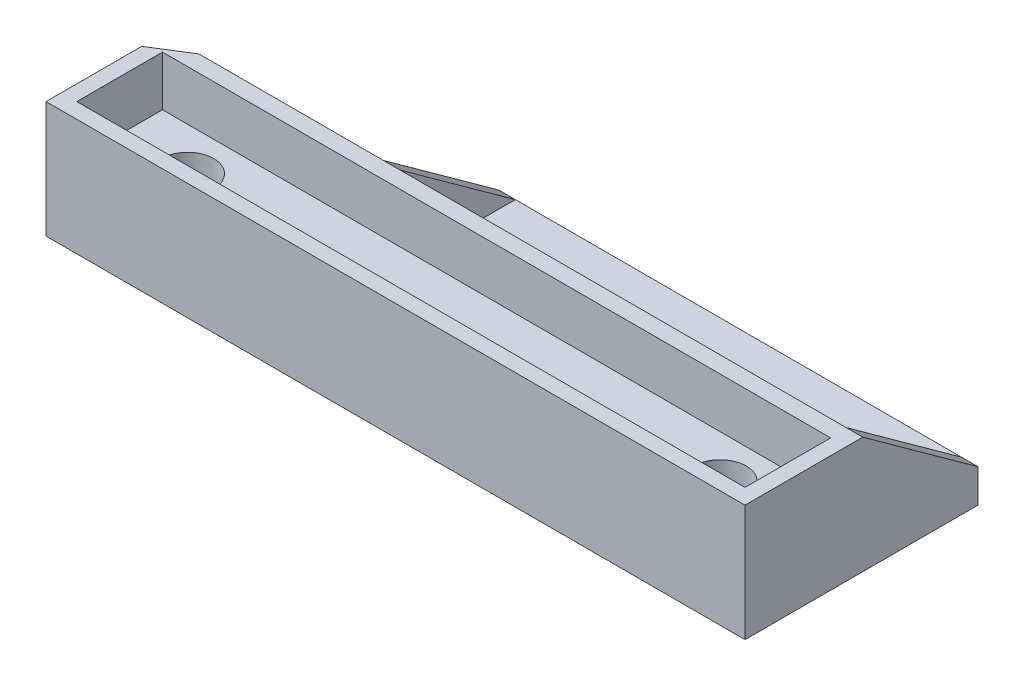
ISO-10303-21;
HEADER;
FILE_DESCRIPTION(('STEP AP214'),'2;1');
FILE_NAME('part.step','',(''),(''),'','','');
FILE_SCHEMA(('AUTOMOTIVE_DESIGN { 1 0 10303 214 1 1 1 1 }'));
ENDSEC;
DATA;
#1=APPLICATION_CONTEXT('core data for automotive mechanical design processes');
#2=APPLICATION_PROTOCOL_DEFINITION('international standard','automotive_design',2000,#1);
#3=PRODUCT_CONTEXT('',#1,'mechanical');
#4=PRODUCT('Part','Part','',(#3));
#5=PRODUCT_RELATED_PRODUCT_CATEGORY('part','',(#4));
#6=PRODUCT_DEFINITION_FORMATION('','',#4);
#7=PRODUCT_DEFINITION_CONTEXT('part definition',#1,'design');
#8=PRODUCT_DEFINITION('design','',#6,#7);
#9=PRODUCT_DEFINITION_SHAPE('','',#8);
#10=(LENGTH_UNIT() NAMED_UNIT(*) SI_UNIT(.MILLI.,.METRE.));
#11=(NAMED_UNIT(*) PLANE_ANGLE_UNIT() SI_UNIT($,.RADIAN.));
#12=(NAMED_UNIT(*) SI_UNIT($,.STERADIAN.) SOLID_ANGLE_UNIT());
#13=UNCERTAINTY_MEASURE_WITH_UNIT(LENGTH_MEASURE(1.E-05),#10,'distance_accuracy_value','');
#14=(GEOMETRIC_REPRESENTATION_CONTEXT(3) GLOBAL_UNCERTAINTY_ASSIGNED_CONTEXT((#13)) GLOBAL_UNIT_ASSIGNED_CONTEXT((#10,
#11,#12)) REPRESENTATION_CONTEXT('',''));
#15=CARTESIAN_POINT('',(0.,0.,0.));
#16=DIRECTION('',(0.,0.,1.));
#17=DIRECTION('',(1.,0.,0.));
#18=AXIS2_PLACEMENT_3D('',#15,#16,#17);
#19=CARTESIAN_POINT('',(5.,7.,-3.49999999993634));
#20=DIRECTION('',(0.,-1.,0.));
#21=DIRECTION('',(0.,0.,-1.));
#22=AXIS2_PLACEMENT_3D('',#19,#20,#21);
#23=CYLINDRICAL_SURFACE('',#22,1.575);
#24=CARTESIAN_POINT('',(5.,0.,-3.49999999993634));
#25=DIRECTION('',(0.,-1.,0.));
#26=DIRECTION('',(0.,0.,1.));
#27=AXIS2_PLACEMENT_3D('',#24,#25,#26);
#28=CIRCLE('',#27,1.575);
#29=CARTESIAN_POINT('',(5.,0.,-1.92499999993634));
#30=VERTEX_POINT('',#29);
#31=EDGE_CURVE('E227',#30,#30,#28,.T.);
#32=ORIENTED_EDGE('',*,*,#31,.T.);
#33=EDGE_LOOP('',(#32));
#34=FACE_BOUND('',#33,.T.);
#35=CARTESIAN_POINT('',(5.,4.,-3.49999999993634));
#36=DIRECTION('',(0.,1.,0.));
#37=DIRECTION('',(0.,0.,1.));
#38=AXIS2_PLACEMENT_3D('',#35,#36,#37);
#39=CIRCLE('',#38,1.575);
#40=CARTESIAN_POINT('',(5.,4.,-1.92499999993634));
#41=VERTEX_POINT('',#40);
#42=EDGE_CURVE('E224',#41,#41,#39,.F.);
#43=ORIENTED_EDGE('',*,*,#42,.F.);
#44=EDGE_LOOP('',(#43));
#45=FACE_BOUND('',#44,.T.);
#46=ADVANCED_FACE('F41',(#34,#45),#23,.F.);
#47=CARTESIAN_POINT('',(37.,7.,-3.49999999993633));
#48=DIRECTION('',(0.,-1.,0.));
#49=DIRECTION('',(0.,0.,-1.));
#50=AXIS2_PLACEMENT_3D('',#47,#48,#49);
#51=CYLINDRICAL_SURFACE('',#50,1.575);
#52=CARTESIAN_POINT('',(37.,0.,-3.49999999993633));
#53=DIRECTION('',(0.,-1.,0.));
#54=DIRECTION('',(0.,0.,-1.));
#55=AXIS2_PLACEMENT_3D('',#52,#53,#54);
#56=CIRCLE('',#55,1.575);
#57=CARTESIAN_POINT('',(37.,0.,-5.07499999993633));
#58=VERTEX_POINT('',#57);
#59=EDGE_CURVE('E228',#58,#58,#56,.T.);
#60=ORIENTED_EDGE('',*,*,#59,.T.);
#61=EDGE_LOOP('',(#60));
#62=FACE_BOUND('',#61,.T.);
#63=CARTESIAN_POINT('',(37.,4.,-3.49999999993633));
#64=DIRECTION('',(0.,1.,0.));
#65=DIRECTION('',(0.,0.,1.));
#66=AXIS2_PLACEMENT_3D('',#63,#64,#65);
#67=CIRCLE('',#66,1.575);
#68=CARTESIAN_POINT('',(37.,4.,-1.92499999993633));
#69=VERTEX_POINT('',#68);
#70=EDGE_CURVE('E217',#69,#69,#67,.F.);
#71=ORIENTED_EDGE('',*,*,#70,.F.);
#72=EDGE_LOOP('',(#71));
#73=FACE_BOUND('',#72,.T.);
#74=ADVANCED_FACE('F369',(#62,#73),#51,.F.);
#75=CARTESIAN_POINT('',(42.,7.,-6.99999999987266));
#76=DIRECTION('',(-1.,0.,0.));
#77=DIRECTION('',(0.,0.,1.));
#78=AXIS2_PLACEMENT_3D('',#75,#76,#77);
#79=PLANE('',#78);
#80=DIRECTION('',(0.,-1.,0.));
#81=VECTOR('',#80,1.);
#82=CARTESIAN_POINT('',(42.,7.,-13.9999999998727));
#83=LINE('',#82,#81);
#84=CARTESIAN_POINT('',(42.,2.,-13.9999999998727));
#85=VERTEX_POINT('',#84);
#86=CARTESIAN_POINT('',(42.,0.,-13.9999999998727));
#87=VERTEX_POINT('',#86);
#88=EDGE_CURVE('E175',#85,#87,#83,.T.);
#89=ORIENTED_EDGE('',*,*,#88,.F.);
#90=DIRECTION('',(0.,0.585383683581828,0.810756401760831));
#91=VECTOR('',#90,1.);
#92=CARTESIAN_POINT('',(42.,7.,-7.07499999987266));
#93=LINE('',#92,#91);
#94=CARTESIAN_POINT('',(42.,7.,-7.07499999987266));
#95=VERTEX_POINT('',#94);
#96=EDGE_CURVE('E156',#85,#95,#93,.T.);
#97=ORIENTED_EDGE('',*,*,#96,.T.);
#98=DIRECTION('',(0.,0.,-1.));
#99=VECTOR('',#98,1.);
#100=CARTESIAN_POINT('',(42.,7.,-6.99999999987266));
#101=LINE('',#100,#99);
#102=CARTESIAN_POINT('',(42.,7.,0.));
#103=VERTEX_POINT('',#102);
#104=EDGE_CURVE('E233',#103,#95,#101,.T.);
#105=ORIENTED_EDGE('',*,*,#104,.F.);
#106=DIRECTION('',(0.,-1.,0.));
#107=VECTOR('',#106,1.);
#108=CARTESIAN_POINT('',(42.,7.,0.));
#109=LINE('',#108,#107);
#110=CARTESIAN_POINT('',(42.,0.,0.));
#111=VERTEX_POINT('',#110);
#112=EDGE_CURVE('E242',#103,#111,#109,.T.);
#113=ORIENTED_EDGE('',*,*,#112,.T.);
#114=DIRECTION('',(0.,0.,-1.));
#115=VECTOR('',#114,1.);
#116=CARTESIAN_POINT('',(42.,0.,-6.99999999987266));
#117=LINE('',#116,#115);
#118=EDGE_CURVE('E185',#111,#87,#117,.T.);
#119=ORIENTED_EDGE('',*,*,#118,.T.);
#120=EDGE_LOOP('',(#89,#97,#105,#113,#119));
#121=FACE_BOUND('',#120,.T.);
#122=ADVANCED_FACE('F182',(#121),#79,.F.);
#123=CARTESIAN_POINT('',(0.,7.,-5.75));
#124=DIRECTION('',(0.529919264233527,0.,0.848048096156224));
#125=DIRECTION('',(0.848048096156224,0.,-0.529919264233527));
#126=AXIS2_PLACEMENT_3D('',#123,#124,#125);
#127=PLANE('',#126);
#128=DIRECTION('',(-0.848048096156224,0.,0.529919264233527));
#129=VECTOR('',#128,1.);
#130=CARTESIAN_POINT('',(0.,7.,-5.75));
#131=LINE('',#130,#129);
#132=CARTESIAN_POINT('',(2.12044325077533,7.,-7.07499999987266));
#133=VERTEX_POINT('',#132);
#134=CARTESIAN_POINT('',(0.,7.,-5.75));
#135=VERTEX_POINT('',#134);
#136=EDGE_CURVE('E235',#133,#135,#131,.T.);
#137=ORIENTED_EDGE('',*,*,#136,.F.);
#138=DIRECTION('',(0.,1.,0.));
#139=VECTOR('',#138,1.);
#140=CARTESIAN_POINT('',(2.12044325077533,2.,-7.07499999987266));
#141=LINE('',#140,#139);
#142=CARTESIAN_POINT('',(2.12044325077533,3.,-7.07499999987266));
#143=VERTEX_POINT('',#142);
#144=EDGE_CURVE('E284',#143,#133,#141,.T.);
#145=ORIENTED_EDGE('',*,*,#144,.F.);
#146=DIRECTION('',(-0.749337346632538,0.468237942152119,0.468237942152125));
#147=VECTOR('',#146,1.);
#148=CARTESIAN_POINT('',(-0.938572373960924,4.91148511091009,-5.16351488896254));
#149=LINE('',#148,#147);
#150=CARTESIAN_POINT('',(3.72077777981619,2.,-8.07499999987267));
#151=VERTEX_POINT('',#150);
#152=EDGE_CURVE('E11',#143,#151,#149,.F.);
#153=ORIENTED_EDGE('',*,*,#152,.T.);
#154=DIRECTION('',(-0.848048096156395,0.,0.529919264233255));
#155=VECTOR('',#154,1.);
#156=CARTESIAN_POINT('',(13.2027598643832,2.,-13.9999999998727));
#157=LINE('',#156,#155);
#158=CARTESIAN_POINT('',(13.2027598643832,2.,-13.9999999998727));
#159=VERTEX_POINT('',#158);
#160=EDGE_CURVE('E277',#159,#151,#157,.T.);
#161=ORIENTED_EDGE('',*,*,#160,.F.);
#162=DIRECTION('',(0.,-1.,0.));
#163=VECTOR('',#162,1.);
#164=CARTESIAN_POINT('',(13.2027598643832,7.,-13.9999999998727));
#165=LINE('',#164,#163);
#166=CARTESIAN_POINT('',(13.2027598643832,0.,-13.9999999998727));
#167=VERTEX_POINT('',#166);
#168=EDGE_CURVE('E188',#159,#167,#165,.T.);
#169=ORIENTED_EDGE('',*,*,#168,.T.);
#170=DIRECTION('',(-0.848048096156224,0.,0.529919264233527));
#171=VECTOR('',#170,1.);
#172=CARTESIAN_POINT('',(0.,0.,-5.75));
#173=LINE('',#172,#171);
#174=CARTESIAN_POINT('',(0.,0.,-5.75));
#175=VERTEX_POINT('',#174);
#176=EDGE_CURVE('E244',#167,#175,#173,.T.);
#177=ORIENTED_EDGE('',*,*,#176,.T.);
#178=DIRECTION('',(0.,-1.,0.));
#179=VECTOR('',#178,1.);
#180=CARTESIAN_POINT('',(0.,7.,-5.75));
#181=LINE('',#180,#179);
#182=EDGE_CURVE('E253',#135,#175,#181,.T.);
#183=ORIENTED_EDGE('',*,*,#182,.F.);
#184=EDGE_LOOP('',(#137,#145,#153,#161,#169,#177,#183));
#185=FACE_BOUND('',#184,.T.);
#186=ADVANCED_FACE('F339',(#185),#127,.F.);
#187=CARTESIAN_POINT('',(0.,7.,-5.75));
#188=DIRECTION('',(1.,0.,0.));
#189=DIRECTION('',(0.,0.,-1.));
#190=AXIS2_PLACEMENT_3D('',#187,#188,#189);
#191=PLANE('',#190);
#192=DIRECTION('',(0.,0.,1.));
#193=VECTOR('',#192,1.);
#194=CARTESIAN_POINT('',(0.,0.,-5.75));
#195=LINE('',#194,#193);
#196=CARTESIAN_POINT('',(0.,0.,0.));
#197=VERTEX_POINT('',#196);
#198=EDGE_CURVE('E246',#175,#197,#195,.T.);
#199=ORIENTED_EDGE('',*,*,#198,.T.);
#200=DIRECTION('',(0.,-1.,0.));
#201=VECTOR('',#200,1.);
#202=CARTESIAN_POINT('',(0.,7.,0.));
#203=LINE('',#202,#201);
#204=CARTESIAN_POINT('',(0.,7.,0.));
#205=VERTEX_POINT('',#204);
#206=EDGE_CURVE('E250',#205,#197,#203,.T.);
#207=ORIENTED_EDGE('',*,*,#206,.F.);
#208=DIRECTION('',(0.,0.,1.));
#209=VECTOR('',#208,1.);
#210=CARTESIAN_POINT('',(0.,7.,-5.75));
#211=LINE('',#210,#209);
#212=EDGE_CURVE('E238',#135,#205,#211,.T.);
#213=ORIENTED_EDGE('',*,*,#212,.F.);
#214=ORIENTED_EDGE('',*,*,#182,.T.);
#215=EDGE_LOOP('',(#199,#207,#213,#214));
#216=FACE_BOUND('',#215,.T.);
#217=ADVANCED_FACE('F345',(#216),#191,.F.);
#218=CARTESIAN_POINT('',(0.,7.,0.));
#219=DIRECTION('',(0.,0.,-1.));
#220=DIRECTION('',(-1.,0.,0.));
#221=AXIS2_PLACEMENT_3D('',#218,#219,#220);
#222=PLANE('',#221);
#223=DIRECTION('',(1.,0.,0.));
#224=VECTOR('',#223,1.);
#225=CARTESIAN_POINT('',(0.,0.,0.));
#226=LINE('',#225,#224);
#227=EDGE_CURVE('E236',#197,#111,#226,.T.);
#228=ORIENTED_EDGE('',*,*,#227,.T.);
#229=ORIENTED_EDGE('',*,*,#112,.F.);
#230=DIRECTION('',(1.,0.,0.));
#231=VECTOR('',#230,1.);
#232=CARTESIAN_POINT('',(0.,7.,0.));
#233=LINE('',#232,#231);
#234=EDGE_CURVE('E240',#205,#103,#233,.T.);
#235=ORIENTED_EDGE('',*,*,#234,.F.);
#236=ORIENTED_EDGE('',*,*,#206,.T.);
#237=EDGE_LOOP('',(#228,#229,#235,#236));
#238=FACE_BOUND('',#237,.T.);
#239=ADVANCED_FACE('F349',(#238),#222,.F.);
#240=CARTESIAN_POINT('',(0.,7.,0.));
#241=DIRECTION('',(0.,1.,0.));
#242=DIRECTION('',(0.,0.,1.));
#243=AXIS2_PLACEMENT_3D('',#240,#241,#242);
#244=PLANE('',#243);
#245=DIRECTION('',(-1.,0.,0.));
#246=VECTOR('',#245,1.);
#247=CARTESIAN_POINT('',(42.,7.,-7.07499999987266));
#248=LINE('',#247,#246);
#249=CARTESIAN_POINT('',(14.2027598643832,7.,-7.07499999987266));
#250=VERTEX_POINT('',#249);
#251=CARTESIAN_POINT('',(13.2027598643832,7.,-7.07499999987266));
#252=VERTEX_POINT('',#251);
#253=EDGE_CURVE('E180',#250,#252,#248,.T.);
#254=ORIENTED_EDGE('',*,*,#253,.T.);
#255=DIRECTION('',(1.,0.,0.));
#256=VECTOR('',#255,1.);
#257=CARTESIAN_POINT('',(2.12044325077533,7.,-7.07499999987266));
#258=LINE('',#257,#256);
#259=EDGE_CURVE('E286',#133,#252,#258,.T.);
#260=ORIENTED_EDGE('',*,*,#259,.F.);
#261=ORIENTED_EDGE('',*,*,#136,.T.);
#262=ORIENTED_EDGE('',*,*,#212,.T.);
#263=ORIENTED_EDGE('',*,*,#234,.T.);
#264=ORIENTED_EDGE('',*,*,#104,.T.);
#265=CARTESIAN_POINT('',(41.,7.,-7.07499999987266));
#266=VERTEX_POINT('',#265);
#267=EDGE_CURVE('E163',#95,#266,#248,.T.);
#268=ORIENTED_EDGE('',*,*,#267,.T.);
#269=DIRECTION('',(1.,0.,0.));
#270=VECTOR('',#269,1.);
#271=CARTESIAN_POINT('',(41.,7.,-7.07499999987266));
#272=LINE('',#271,#270);
#273=EDGE_CURVE('E302',#250,#266,#272,.T.);
#274=ORIENTED_EDGE('',*,*,#273,.F.);
#275=EDGE_LOOP('',(#254,#260,#261,#262,#263,#264,#268,#274));
#276=FACE_BOUND('',#275,.T.);
#277=DIRECTION('',(0.,0.,1.));
#278=VECTOR('',#277,1.);
#279=CARTESIAN_POINT('',(0.925000000000002,7.,-6.07499999987266));
#280=LINE('',#279,#278);
#281=CARTESIAN_POINT('',(0.925000000000002,7.,-6.07499999987266));
#282=VERTEX_POINT('',#281);
#283=CARTESIAN_POINT('',(0.925000000000003,7.,-0.924999999872662));
#284=VERTEX_POINT('',#283);
#285=EDGE_CURVE('E187',#282,#284,#280,.T.);
#286=ORIENTED_EDGE('',*,*,#285,.F.);
#287=DIRECTION('',(1.,0.,0.));
#288=VECTOR('',#287,1.);
#289=CARTESIAN_POINT('',(0.925000000000002,7.,-6.07499999987266));
#290=LINE('',#289,#288);
#291=CARTESIAN_POINT('',(41.075,7.,-6.07499999987266));
#292=VERTEX_POINT('',#291);
#293=EDGE_CURVE('E200',#282,#292,#290,.T.);
#294=ORIENTED_EDGE('',*,*,#293,.T.);
#295=DIRECTION('',(0.,0.,1.));
#296=VECTOR('',#295,1.);
#297=CARTESIAN_POINT('',(41.075,7.,-6.07499999987266));
#298=LINE('',#297,#296);
#299=CARTESIAN_POINT('',(41.075,7.,-0.924999999872662));
#300=VERTEX_POINT('',#299);
#301=EDGE_CURVE('E210',#292,#300,#298,.T.);
#302=ORIENTED_EDGE('',*,*,#301,.T.);
#303=DIRECTION('',(1.,0.,0.));
#304=VECTOR('',#303,1.);
#305=CARTESIAN_POINT('',(0.925000000000003,7.,-0.924999999872662));
#306=LINE('',#305,#304);
#307=EDGE_CURVE('E190',#284,#300,#306,.T.);
#308=ORIENTED_EDGE('',*,*,#307,.F.);
#309=EDGE_LOOP('',(#286,#294,#302,#308));
#310=FACE_BOUND('',#309,.T.);
#311=ADVANCED_FACE('F335',(#276,#310),#244,.T.);
#312=CARTESIAN_POINT('',(0.,0.,0.));
#313=DIRECTION('',(0.,1.,0.));
#314=DIRECTION('',(0.,0.,1.));
#315=AXIS2_PLACEMENT_3D('',#312,#313,#314);
#316=PLANE('',#315);
#317=ORIENTED_EDGE('',*,*,#59,.F.);
#318=EDGE_LOOP('',(#317));
#319=FACE_BOUND('',#318,.T.);
#320=ORIENTED_EDGE('',*,*,#31,.F.);
#321=EDGE_LOOP('',(#320));
#322=FACE_BOUND('',#321,.T.);
#323=ORIENTED_EDGE('',*,*,#118,.F.);
#324=ORIENTED_EDGE('',*,*,#227,.F.);
#325=ORIENTED_EDGE('',*,*,#198,.F.);
#326=ORIENTED_EDGE('',*,*,#176,.F.);
#327=DIRECTION('',(-1.,0.,0.));
#328=VECTOR('',#327,1.);
#329=CARTESIAN_POINT('',(42.,0.,-13.9999999998727));
#330=LINE('',#329,#328);
#331=EDGE_CURVE('E192',#87,#167,#330,.T.);
#332=ORIENTED_EDGE('',*,*,#331,.F.);
#333=EDGE_LOOP('',(#323,#324,#325,#326,#332));
#334=FACE_BOUND('',#333,.T.);
#335=ADVANCED_FACE('F352',(#319,#322,#334),#316,.F.);
#336=CARTESIAN_POINT('',(0.,4.,0.));
#337=DIRECTION('',(0.,1.,0.));
#338=DIRECTION('',(0.,0.,1.));
#339=AXIS2_PLACEMENT_3D('',#336,#337,#338);
#340=PLANE('',#339);
#341=DIRECTION('',(0.,0.,1.));
#342=VECTOR('',#341,1.);
#343=CARTESIAN_POINT('',(0.925000000000002,4.,-6.07499999987266));
#344=LINE('',#343,#342);
#345=CARTESIAN_POINT('',(0.925000000000002,4.,-6.07499999987266));
#346=VERTEX_POINT('',#345);
#347=CARTESIAN_POINT('',(0.925000000000003,4.,-0.924999999872662));
#348=VERTEX_POINT('',#347);
#349=EDGE_CURVE('E196',#346,#348,#344,.T.);
#350=ORIENTED_EDGE('',*,*,#349,.T.);
#351=DIRECTION('',(1.,0.,0.));
#352=VECTOR('',#351,1.);
#353=CARTESIAN_POINT('',(0.925000000000003,4.,-0.924999999872662));
#354=LINE('',#353,#352);
#355=CARTESIAN_POINT('',(41.075,4.,-0.924999999872662));
#356=VERTEX_POINT('',#355);
#357=EDGE_CURVE('E199',#348,#356,#354,.T.);
#358=ORIENTED_EDGE('',*,*,#357,.T.);
#359=DIRECTION('',(0.,0.,1.));
#360=VECTOR('',#359,1.);
#361=CARTESIAN_POINT('',(41.075,4.,-6.07499999987266));
#362=LINE('',#361,#360);
#363=CARTESIAN_POINT('',(41.075,4.,-6.07499999987266));
#364=VERTEX_POINT('',#363);
#365=EDGE_CURVE('E203',#364,#356,#362,.T.);
#366=ORIENTED_EDGE('',*,*,#365,.F.);
#367=DIRECTION('',(1.,0.,0.));
#368=VECTOR('',#367,1.);
#369=CARTESIAN_POINT('',(0.925000000000002,4.,-6.07499999987266));
#370=LINE('',#369,#368);
#371=EDGE_CURVE('E205',#346,#364,#370,.T.);
#372=ORIENTED_EDGE('',*,*,#371,.F.);
#373=EDGE_LOOP('',(#350,#358,#366,#372));
#374=FACE_BOUND('',#373,.T.);
#375=ORIENTED_EDGE('',*,*,#70,.T.);
#376=EDGE_LOOP('',(#375));
#377=FACE_BOUND('',#376,.T.);
#378=ORIENTED_EDGE('',*,*,#42,.T.);
#379=EDGE_LOOP('',(#378));
#380=FACE_BOUND('',#379,.T.);
#381=ADVANCED_FACE('F354',(#374,#377,#380),#340,.T.);
#382=CARTESIAN_POINT('',(0.925000000000002,4.,-6.07499999987266));
#383=DIRECTION('',(-1.,0.,0.));
#384=DIRECTION('',(0.,0.,1.));
#385=AXIS2_PLACEMENT_3D('',#382,#383,#384);
#386=PLANE('',#385);
#387=ORIENTED_EDGE('',*,*,#285,.T.);
#388=DIRECTION('',(0.,1.,0.));
#389=VECTOR('',#388,1.);
#390=CARTESIAN_POINT('',(0.925000000000003,4.,-0.924999999872662));
#391=LINE('',#390,#389);
#392=EDGE_CURVE('E206',#348,#284,#391,.T.);
#393=ORIENTED_EDGE('',*,*,#392,.F.);
#394=ORIENTED_EDGE('',*,*,#349,.F.);
#395=DIRECTION('',(0.,1.,0.));
#396=VECTOR('',#395,1.);
#397=CARTESIAN_POINT('',(0.925000000000002,4.,-6.07499999987266));
#398=LINE('',#397,#396);
#399=EDGE_CURVE('E215',#346,#282,#398,.T.);
#400=ORIENTED_EDGE('',*,*,#399,.T.);
#401=EDGE_LOOP('',(#387,#393,#394,#400));
#402=FACE_BOUND('',#401,.T.);
#403=ADVANCED_FACE('F361',(#402),#386,.F.);
#404=CARTESIAN_POINT('',(0.925000000000002,4.,-6.07499999987266));
#405=DIRECTION('',(0.,0.,1.));
#406=DIRECTION('',(1.,0.,0.));
#407=AXIS2_PLACEMENT_3D('',#404,#405,#406);
#408=PLANE('',#407);
#409=ORIENTED_EDGE('',*,*,#293,.F.);
#410=ORIENTED_EDGE('',*,*,#399,.F.);
#411=ORIENTED_EDGE('',*,*,#371,.T.);
#412=DIRECTION('',(0.,1.,0.));
#413=VECTOR('',#412,1.);
#414=CARTESIAN_POINT('',(41.075,4.,-6.07499999987266));
#415=LINE('',#414,#413);
#416=EDGE_CURVE('E218',#364,#292,#415,.T.);
#417=ORIENTED_EDGE('',*,*,#416,.T.);
#418=EDGE_LOOP('',(#409,#410,#411,#417));
#419=FACE_BOUND('',#418,.T.);
#420=ADVANCED_FACE('F381',(#419),#408,.T.);
#421=CARTESIAN_POINT('',(41.075,4.,-6.07499999987266));
#422=DIRECTION('',(-1.,0.,0.));
#423=DIRECTION('',(0.,0.,1.));
#424=AXIS2_PLACEMENT_3D('',#421,#422,#423);
#425=PLANE('',#424);
#426=ORIENTED_EDGE('',*,*,#301,.F.);
#427=ORIENTED_EDGE('',*,*,#416,.F.);
#428=ORIENTED_EDGE('',*,*,#365,.T.);
#429=DIRECTION('',(0.,1.,0.));
#430=VECTOR('',#429,1.);
#431=CARTESIAN_POINT('',(41.075,4.,-0.924999999872662));
#432=LINE('',#431,#430);
#433=EDGE_CURVE('E220',#356,#300,#432,.T.);
#434=ORIENTED_EDGE('',*,*,#433,.T.);
#435=EDGE_LOOP('',(#426,#427,#428,#434));
#436=FACE_BOUND('',#435,.T.);
#437=ADVANCED_FACE('F386',(#436),#425,.T.);
#438=CARTESIAN_POINT('',(0.925000000000003,4.,-0.924999999872662));
#439=DIRECTION('',(0.,0.,1.));
#440=DIRECTION('',(1.,0.,0.));
#441=AXIS2_PLACEMENT_3D('',#438,#439,#440);
#442=PLANE('',#441);
#443=ORIENTED_EDGE('',*,*,#307,.T.);
#444=ORIENTED_EDGE('',*,*,#433,.F.);
#445=ORIENTED_EDGE('',*,*,#357,.F.);
#446=ORIENTED_EDGE('',*,*,#392,.T.);
#447=EDGE_LOOP('',(#443,#444,#445,#446));
#448=FACE_BOUND('',#447,.T.);
#449=ADVANCED_FACE('F383',(#448),#442,.F.);
#450=CARTESIAN_POINT('',(42.,7.,-13.9999999998727));
#451=DIRECTION('',(0.,0.,1.));
#452=DIRECTION('',(1.,0.,0.));
#453=AXIS2_PLACEMENT_3D('',#450,#451,#452);
#454=PLANE('',#453);
#455=ORIENTED_EDGE('',*,*,#168,.F.);
#456=DIRECTION('',(-1.,0.,0.));
#457=VECTOR('',#456,1.);
#458=CARTESIAN_POINT('',(42.,2.,-13.9999999998727));
#459=LINE('',#458,#457);
#460=CARTESIAN_POINT('',(14.2027598643832,2.,-13.9999999998727));
#461=VERTEX_POINT('',#460);
#462=EDGE_CURVE('E168',#461,#159,#459,.T.);
#463=ORIENTED_EDGE('',*,*,#462,.F.);
#464=DIRECTION('',(-1.,0.,0.));
#465=VECTOR('',#464,1.);
#466=CARTESIAN_POINT('',(14.2027598643832,2.,-13.9999999998727));
#467=LINE('',#466,#465);
#468=CARTESIAN_POINT('',(41.,2.,-13.9999999998727));
#469=VERTEX_POINT('',#468);
#470=EDGE_CURVE('E179',#469,#461,#467,.T.);
#471=ORIENTED_EDGE('',*,*,#470,.F.);
#472=EDGE_CURVE('E160',#85,#469,#459,.T.);
#473=ORIENTED_EDGE('',*,*,#472,.F.);
#474=ORIENTED_EDGE('',*,*,#88,.T.);
#475=ORIENTED_EDGE('',*,*,#331,.T.);
#476=EDGE_LOOP('',(#455,#463,#471,#473,#474,#475));
#477=FACE_BOUND('',#476,.T.);
#478=ADVANCED_FACE('F173',(#477),#454,.F.);
#479=CARTESIAN_POINT('',(13.2027598643832,2.,-7.07499999987266));
#480=DIRECTION('',(1.,0.,0.));
#481=DIRECTION('',(0.,0.,-1.));
#482=AXIS2_PLACEMENT_3D('',#479,#480,#481);
#483=PLANE('',#482);
#484=DIRECTION('',(0.,0.,-1.));
#485=VECTOR('',#484,1.);
#486=CARTESIAN_POINT('',(13.2027598643832,2.,-7.07499999987266));
#487=LINE('',#486,#485);
#488=CARTESIAN_POINT('',(13.2027598643832,2.,-8.07499999987267));
#489=VERTEX_POINT('',#488);
#490=EDGE_CURVE('E274',#489,#159,#487,.T.);
#491=ORIENTED_EDGE('',*,*,#490,.F.);
#492=DIRECTION('',(0.,-0.707106781186543,-0.707106781186552));
#493=VECTOR('',#492,1.);
#494=CARTESIAN_POINT('',(13.2027598643832,2.,-8.07499999987267));
#495=LINE('',#494,#493);
#496=CARTESIAN_POINT('',(13.2027598643832,3.,-7.07499999987266));
#497=VERTEX_POINT('',#496);
#498=EDGE_CURVE('E64',#489,#497,#495,.F.);
#499=ORIENTED_EDGE('',*,*,#498,.T.);
#500=DIRECTION('',(0.,1.,0.));
#501=VECTOR('',#500,1.);
#502=CARTESIAN_POINT('',(13.2027598643832,2.,-7.07499999987266));
#503=LINE('',#502,#501);
#504=EDGE_CURVE('E288',#497,#252,#503,.T.);
#505=ORIENTED_EDGE('',*,*,#504,.T.);
#506=DIRECTION('',(0.,-0.585383683581828,-0.810756401760832));
#507=VECTOR('',#506,1.);
#508=CARTESIAN_POINT('',(13.2027598643832,5.28662971498086,-9.44801784462418));
#509=LINE('',#508,#507);
#510=EDGE_CURVE('E283',#252,#159,#509,.T.);
#511=ORIENTED_EDGE('',*,*,#510,.T.);
#512=EDGE_LOOP('',(#491,#499,#505,#511));
#513=FACE_BOUND('',#512,.T.);
#514=ADVANCED_FACE('F281',(#513),#483,.F.);
#515=CARTESIAN_POINT('',(2.12044325077533,2.,-7.07499999987266));
#516=DIRECTION('',(0.,0.,1.));
#517=DIRECTION('',(1.,0.,0.));
#518=AXIS2_PLACEMENT_3D('',#515,#516,#517);
#519=PLANE('',#518);
#520=ORIENTED_EDGE('',*,*,#504,.F.);
#521=DIRECTION('',(-1.,0.,0.));
#522=VECTOR('',#521,1.);
#523=CARTESIAN_POINT('',(2.12044325077533,3.,-7.07499999987266));
#524=LINE('',#523,#522);
#525=EDGE_CURVE('E50',#497,#143,#524,.T.);
#526=ORIENTED_EDGE('',*,*,#525,.T.);
#527=ORIENTED_EDGE('',*,*,#144,.T.);
#528=ORIENTED_EDGE('',*,*,#259,.T.);
#529=EDGE_LOOP('',(#520,#526,#527,#528));
#530=FACE_BOUND('',#529,.T.);
#531=ADVANCED_FACE('F333',(#530),#519,.F.);
#532=CARTESIAN_POINT('',(0.,2.,0.));
#533=DIRECTION('',(0.,-1.,0.));
#534=DIRECTION('',(0.,0.,-1.));
#535=AXIS2_PLACEMENT_3D('',#532,#533,#534);
#536=PLANE('',#535);
#537=ORIENTED_EDGE('',*,*,#160,.T.);
#538=DIRECTION('',(1.,0.,0.));
#539=VECTOR('',#538,1.);
#540=CARTESIAN_POINT('',(13.2027598643832,2.,-8.07499999987267));
#541=LINE('',#540,#539);
#542=EDGE_CURVE('E267',#151,#489,#541,.T.);
#543=ORIENTED_EDGE('',*,*,#542,.T.);
#544=ORIENTED_EDGE('',*,*,#490,.T.);
#545=EDGE_LOOP('',(#537,#543,#544));
#546=FACE_BOUND('',#545,.T.);
#547=ADVANCED_FACE('F273',(#546),#536,.F.);
#548=CARTESIAN_POINT('',(41.,2.,-7.07499999987266));
#549=DIRECTION('',(0.,0.,1.));
#550=DIRECTION('',(1.,0.,0.));
#551=AXIS2_PLACEMENT_3D('',#548,#549,#550);
#552=PLANE('',#551);
#553=DIRECTION('',(0.,1.,0.));
#554=VECTOR('',#553,1.);
#555=CARTESIAN_POINT('',(41.,2.,-7.07499999987266));
#556=LINE('',#555,#554);
#557=CARTESIAN_POINT('',(41.,2.99999999999999,-7.07499999987266));
#558=VERTEX_POINT('',#557);
#559=EDGE_CURVE('E293',#558,#266,#556,.T.);
#560=ORIENTED_EDGE('',*,*,#559,.F.);
#561=DIRECTION('',(-1.,0.,0.));
#562=VECTOR('',#561,1.);
#563=CARTESIAN_POINT('',(14.2027598643832,2.99999999999999,-7.07499999987266));
#564=LINE('',#563,#562);
#565=CARTESIAN_POINT('',(14.2027598643832,2.99999999999999,-7.07499999987266));
#566=VERTEX_POINT('',#565);
#567=EDGE_CURVE('E263',#558,#566,#564,.T.);
#568=ORIENTED_EDGE('',*,*,#567,.T.);
#569=DIRECTION('',(0.,1.,0.));
#570=VECTOR('',#569,1.);
#571=CARTESIAN_POINT('',(14.2027598643832,2.,-7.07499999987266));
#572=LINE('',#571,#570);
#573=EDGE_CURVE('E292',#566,#250,#572,.T.);
#574=ORIENTED_EDGE('',*,*,#573,.T.);
#575=ORIENTED_EDGE('',*,*,#273,.T.);
#576=EDGE_LOOP('',(#560,#568,#574,#575));
#577=FACE_BOUND('',#576,.T.);
#578=ADVANCED_FACE('F327',(#577),#552,.F.);
#579=CARTESIAN_POINT('',(14.2027598643832,2.,-7.07499999987266));
#580=DIRECTION('',(-1.,0.,0.));
#581=DIRECTION('',(0.,0.,1.));
#582=AXIS2_PLACEMENT_3D('',#579,#580,#581);
#583=PLANE('',#582);
#584=ORIENTED_EDGE('',*,*,#573,.F.);
#585=DIRECTION('',(0.,0.707106781186542,0.707106781186553));
#586=VECTOR('',#585,1.);
#587=CARTESIAN_POINT('',(14.2027598643832,2.,-8.07499999987266));
#588=LINE('',#587,#586);
#589=CARTESIAN_POINT('',(14.2027598643832,2.,-8.07499999987267));
#590=VERTEX_POINT('',#589);
#591=EDGE_CURVE('E265',#566,#590,#588,.F.);
#592=ORIENTED_EDGE('',*,*,#591,.T.);
#593=DIRECTION('',(0.,0.,1.));
#594=VECTOR('',#593,1.);
#595=CARTESIAN_POINT('',(14.2027598643832,2.,-7.07499999987266));
#596=LINE('',#595,#594);
#597=EDGE_CURVE('E299',#461,#590,#596,.T.);
#598=ORIENTED_EDGE('',*,*,#597,.F.);
#599=DIRECTION('',(0.,0.585383683581828,0.810756401760832));
#600=VECTOR('',#599,1.);
#601=CARTESIAN_POINT('',(14.2027598643832,5.28662971498086,-9.44801784462418));
#602=LINE('',#601,#600);
#603=EDGE_CURVE('E304',#461,#250,#602,.T.);
#604=ORIENTED_EDGE('',*,*,#603,.T.);
#605=EDGE_LOOP('',(#584,#592,#598,#604));
#606=FACE_BOUND('',#605,.T.);
#607=ADVANCED_FACE('F404',(#606),#583,.F.);
#608=CARTESIAN_POINT('',(41.,2.,-13.9999999998727));
#609=DIRECTION('',(1.,0.,0.));
#610=DIRECTION('',(0.,0.,-1.));
#611=AXIS2_PLACEMENT_3D('',#608,#609,#610);
#612=PLANE('',#611);
#613=DIRECTION('',(0.,0.,-1.));
#614=VECTOR('',#613,1.);
#615=CARTESIAN_POINT('',(41.,2.,-13.9999999998727));
#616=LINE('',#615,#614);
#617=CARTESIAN_POINT('',(41.,2.,-8.07499999987267));
#618=VERTEX_POINT('',#617);
#619=EDGE_CURVE('E311',#618,#469,#616,.T.);
#620=ORIENTED_EDGE('',*,*,#619,.F.);
#621=DIRECTION('',(0.,-0.707106781186542,-0.707106781186553));
#622=VECTOR('',#621,1.);
#623=CARTESIAN_POINT('',(41.,2.,-8.07499999987267));
#624=LINE('',#623,#622);
#625=EDGE_CURVE('E261',#618,#558,#624,.F.);
#626=ORIENTED_EDGE('',*,*,#625,.T.);
#627=ORIENTED_EDGE('',*,*,#559,.T.);
#628=DIRECTION('',(0.,-0.585383683581828,-0.810756401760832));
#629=VECTOR('',#628,1.);
#630=CARTESIAN_POINT('',(41.,2.,-13.9999999998727));
#631=LINE('',#630,#629);
#632=EDGE_CURVE('E307',#266,#469,#631,.T.);
#633=ORIENTED_EDGE('',*,*,#632,.T.);
#634=EDGE_LOOP('',(#620,#626,#627,#633));
#635=FACE_BOUND('',#634,.T.);
#636=ADVANCED_FACE('F326',(#635),#612,.F.);
#637=CARTESIAN_POINT('',(0.,2.,0.));
#638=DIRECTION('',(0.,-1.,0.));
#639=DIRECTION('',(0.,0.,-1.));
#640=AXIS2_PLACEMENT_3D('',#637,#638,#639);
#641=PLANE('',#640);
#642=ORIENTED_EDGE('',*,*,#597,.T.);
#643=DIRECTION('',(1.,0.,0.));
#644=VECTOR('',#643,1.);
#645=CARTESIAN_POINT('',(41.,2.,-8.07499999987267));
#646=LINE('',#645,#644);
#647=EDGE_CURVE('E256',#590,#618,#646,.T.);
#648=ORIENTED_EDGE('',*,*,#647,.T.);
#649=ORIENTED_EDGE('',*,*,#619,.T.);
#650=ORIENTED_EDGE('',*,*,#470,.T.);
#651=EDGE_LOOP('',(#642,#648,#649,#650));
#652=FACE_BOUND('',#651,.T.);
#653=ADVANCED_FACE('F317',(#652),#641,.F.);
#654=CARTESIAN_POINT('',(42.,7.,-7.07499999987266));
#655=DIRECTION('',(0.,-0.810756401760831,0.585383683581828));
#656=DIRECTION('',(0.,-0.585383683581828,-0.810756401760832));
#657=AXIS2_PLACEMENT_3D('',#654,#655,#656);
#658=PLANE('',#657);
#659=ORIENTED_EDGE('',*,*,#267,.F.);
#660=ORIENTED_EDGE('',*,*,#96,.F.);
#661=ORIENTED_EDGE('',*,*,#472,.T.);
#662=ORIENTED_EDGE('',*,*,#632,.F.);
#663=EDGE_LOOP('',(#659,#660,#661,#662));
#664=FACE_BOUND('',#663,.T.);
#665=ADVANCED_FACE('F158',(#664),#658,.F.);
#666=ORIENTED_EDGE('',*,*,#253,.F.);
#667=ORIENTED_EDGE('',*,*,#603,.F.);
#668=ORIENTED_EDGE('',*,*,#462,.T.);
#669=ORIENTED_EDGE('',*,*,#510,.F.);
#670=EDGE_LOOP('',(#666,#667,#668,#669));
#671=FACE_BOUND('',#670,.T.);
#672=ADVANCED_FACE('F411',(#671),#658,.F.);
#673=CARTESIAN_POINT('',(0.,2.,-8.07499999987266));
#674=DIRECTION('',(0.,0.707106781186553,-0.707106781186542));
#675=DIRECTION('',(-1.,0.,0.));
#676=AXIS2_PLACEMENT_3D('',#673,#674,#675);
#677=PLANE('',#676);
#678=ORIENTED_EDGE('',*,*,#591,.F.);
#679=ORIENTED_EDGE('',*,*,#567,.F.);
#680=ORIENTED_EDGE('',*,*,#625,.F.);
#681=ORIENTED_EDGE('',*,*,#647,.F.);
#682=EDGE_LOOP('',(#678,#679,#680,#681));
#683=FACE_BOUND('',#682,.T.);
#684=ADVANCED_FACE('F322',(#683),#677,.T.);
#685=CARTESIAN_POINT('',(0.,2.,-8.07499999987267));
#686=DIRECTION('',(0.,0.707106781186552,-0.707106781186542));
#687=DIRECTION('',(-1.,0.,0.));
#688=AXIS2_PLACEMENT_3D('',#685,#686,#687);
#689=PLANE('',#688);
#690=ORIENTED_EDGE('',*,*,#152,.F.);
#691=ORIENTED_EDGE('',*,*,#525,.F.);
#692=ORIENTED_EDGE('',*,*,#498,.F.);
#693=ORIENTED_EDGE('',*,*,#542,.F.);
#694=EDGE_LOOP('',(#690,#691,#692,#693));
#695=FACE_BOUND('',#694,.T.);
#696=ADVANCED_FACE('F44',(#695),#689,.T.);
#697=CLOSED_SHELL('',(#46,#74,#122,#186,#217,#239,#311,#335,#381,#403,#420,#437,#449,#478,#514,
#531,#547,#578,#607,#636,#653,#665,#672,#684,#696));
#698=MANIFOLD_SOLID_BREP('B2',#697);
#699=ADVANCED_BREP_SHAPE_REPRESENTATION('',(#18,#698),#14);
#700=SHAPE_DEFINITION_REPRESENTATION(#9,#699);
ENDSEC;
END-ISO-10303-21;
